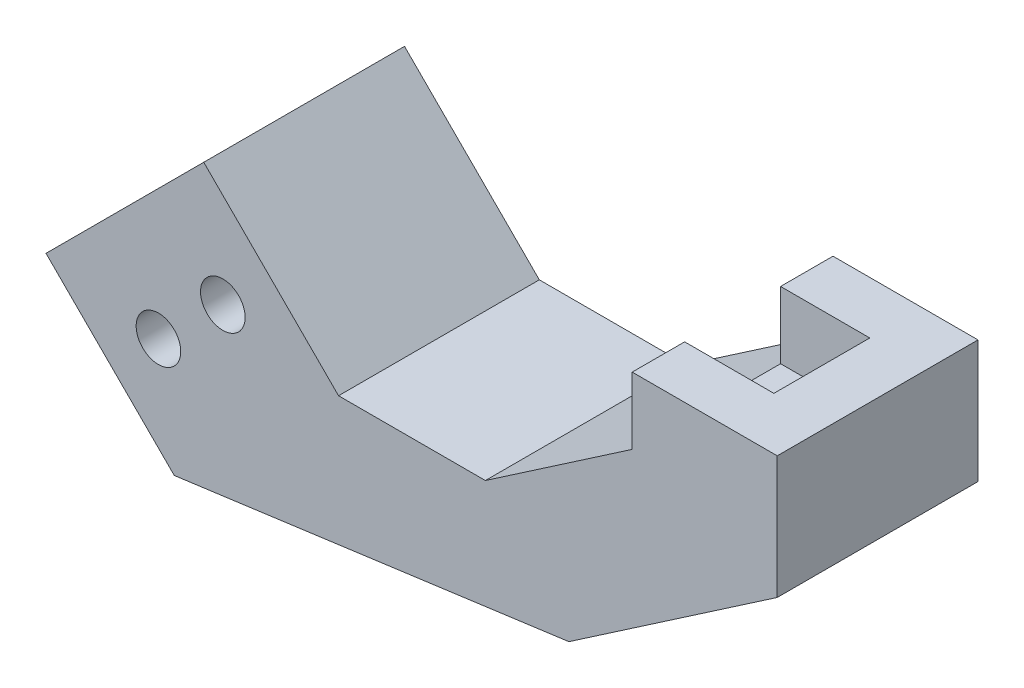
ISO-10303-21;
HEADER;
FILE_DESCRIPTION(('STEP AP214'),'2;1');
FILE_NAME('part.step','',(''),(''),'','','');
FILE_SCHEMA(('AUTOMOTIVE_DESIGN { 1 0 10303 214 1 1 1 1 }'));
ENDSEC;
DATA;
#1=APPLICATION_CONTEXT('core data for automotive mechanical design processes');
#2=APPLICATION_PROTOCOL_DEFINITION('international standard','automotive_design',2000,#1);
#3=PRODUCT_CONTEXT('',#1,'mechanical');
#4=PRODUCT('Part','Part','',(#3));
#5=PRODUCT_RELATED_PRODUCT_CATEGORY('part','',(#4));
#6=PRODUCT_DEFINITION_FORMATION('','',#4);
#7=PRODUCT_DEFINITION_CONTEXT('part definition',#1,'design');
#8=PRODUCT_DEFINITION('design','',#6,#7);
#9=PRODUCT_DEFINITION_SHAPE('','',#8);
#10=(LENGTH_UNIT() NAMED_UNIT(*) SI_UNIT(.MILLI.,.METRE.));
#11=(NAMED_UNIT(*) PLANE_ANGLE_UNIT() SI_UNIT($,.RADIAN.));
#12=(NAMED_UNIT(*) SI_UNIT($,.STERADIAN.) SOLID_ANGLE_UNIT());
#13=UNCERTAINTY_MEASURE_WITH_UNIT(LENGTH_MEASURE(1.E-05),#10,'distance_accuracy_value','');
#14=(GEOMETRIC_REPRESENTATION_CONTEXT(3) GLOBAL_UNCERTAINTY_ASSIGNED_CONTEXT((#13)) GLOBAL_UNIT_ASSIGNED_CONTEXT((#10,
#11,#12)) REPRESENTATION_CONTEXT('',''));
#15=CARTESIAN_POINT('',(0.,0.,0.));
#16=DIRECTION('',(0.,0.,1.));
#17=DIRECTION('',(1.,0.,0.));
#18=AXIS2_PLACEMENT_3D('',#15,#16,#17);
#19=CARTESIAN_POINT('',(0.,0.,5.));
#20=DIRECTION('',(1.,0.,0.));
#21=DIRECTION('',(0.,0.,-1.));
#22=AXIS2_PLACEMENT_3D('',#19,#20,#21);
#23=PLANE('',#22);
#24=DIRECTION('',(0.,-1.,0.));
#25=VECTOR('',#24,1.);
#26=CARTESIAN_POINT('',(0.,15.2784697014109,-8.3));
#27=LINE('',#26,#25);
#28=CARTESIAN_POINT('',(0.,6.,-8.3));
#29=VERTEX_POINT('',#28);
#30=CARTESIAN_POINT('',(0.,0.,-8.3));
#31=VERTEX_POINT('',#30);
#32=EDGE_CURVE('E48',#29,#31,#27,.T.);
#33=ORIENTED_EDGE('',*,*,#32,.T.);
#34=DIRECTION('',(0.,0.,-1.));
#35=VECTOR('',#34,1.);
#36=CARTESIAN_POINT('',(0.,0.,5.));
#37=LINE('',#36,#35);
#38=CARTESIAN_POINT('',(0.,0.,0.3));
#39=VERTEX_POINT('',#38);
#40=EDGE_CURVE('E11',#39,#31,#37,.T.);
#41=ORIENTED_EDGE('',*,*,#40,.F.);
#42=DIRECTION('',(0.,-1.,0.));
#43=VECTOR('',#42,1.);
#44=CARTESIAN_POINT('',(0.,15.2784697014109,0.3));
#45=LINE('',#44,#43);
#46=CARTESIAN_POINT('',(0.,6.,0.3));
#47=VERTEX_POINT('',#46);
#48=EDGE_CURVE('E172',#47,#39,#45,.T.);
#49=ORIENTED_EDGE('',*,*,#48,.F.);
#50=DIRECTION('',(0.,0.,-1.));
#51=VECTOR('',#50,1.);
#52=CARTESIAN_POINT('',(0.,6.,5.));
#53=LINE('',#52,#51);
#54=EDGE_CURVE('E234',#47,#29,#53,.T.);
#55=ORIENTED_EDGE('',*,*,#54,.T.);
#56=EDGE_LOOP('',(#33,#41,#49,#55));
#57=FACE_BOUND('',#56,.T.);
#58=ADVANCED_FACE('F33',(#57),#23,.F.);
#59=CARTESIAN_POINT('',(-8.,0.,5.));
#60=DIRECTION('',(0.,-1.,0.));
#61=DIRECTION('',(0.,0.,-1.));
#62=AXIS2_PLACEMENT_3D('',#59,#60,#61);
#63=PLANE('',#62);
#64=CARTESIAN_POINT('',(-3.,0.,-3.95));
#65=DIRECTION('',(0.,1.,0.));
#66=DIRECTION('',(0.,0.,1.));
#67=AXIS2_PLACEMENT_3D('',#64,#65,#66);
#68=CIRCLE('',#67,1.5);
#69=CARTESIAN_POINT('',(-3.,0.,-2.45));
#70=VERTEX_POINT('',#69);
#71=EDGE_CURVE('E180',#70,#70,#68,.T.);
#72=ORIENTED_EDGE('',*,*,#71,.F.);
#73=EDGE_LOOP('',(#72));
#74=FACE_BOUND('',#73,.T.);
#75=DIRECTION('',(1.,0.,0.));
#76=VECTOR('',#75,1.);
#77=CARTESIAN_POINT('',(-8.,0.,-8.3));
#78=LINE('',#77,#76);
#79=CARTESIAN_POINT('',(-8.,0.,-8.3));
#80=VERTEX_POINT('',#79);
#81=EDGE_CURVE('E54',#80,#31,#78,.T.);
#82=ORIENTED_EDGE('',*,*,#81,.F.);
#83=DIRECTION('',(0.,0.,-1.));
#84=VECTOR('',#83,1.);
#85=CARTESIAN_POINT('',(-8.,0.,5.));
#86=LINE('',#85,#84);
#87=CARTESIAN_POINT('',(-8.,0.,0.3));
#88=VERTEX_POINT('',#87);
#89=EDGE_CURVE('E252',#88,#80,#86,.T.);
#90=ORIENTED_EDGE('',*,*,#89,.F.);
#91=DIRECTION('',(-1.,0.,0.));
#92=VECTOR('',#91,1.);
#93=CARTESIAN_POINT('',(-8.,0.,0.3));
#94=LINE('',#93,#92);
#95=EDGE_CURVE('E146',#39,#88,#94,.T.);
#96=ORIENTED_EDGE('',*,*,#95,.F.);
#97=ORIENTED_EDGE('',*,*,#40,.T.);
#98=EDGE_LOOP('',(#82,#90,#96,#97));
#99=FACE_BOUND('',#98,.T.);
#100=ADVANCED_FACE('F260',(#74,#99),#63,.F.);
#101=CARTESIAN_POINT('',(-8.,0.,5.));
#102=DIRECTION('',(0.56438089256696,-0.82551451114158,0.));
#103=DIRECTION('',(0.82551451114158,0.56438089256696,0.));
#104=AXIS2_PLACEMENT_3D('',#101,#102,#103);
#105=PLANE('',#104);
#106=CARTESIAN_POINT('',(-8.,0.,5.));
#107=VERTEX_POINT('',#106);
#108=EDGE_CURVE('E41',#107,#88,#86,.T.);
#109=ORIENTED_EDGE('',*,*,#108,.T.);
#110=ORIENTED_EDGE('',*,*,#89,.T.);
#111=DIRECTION('',(0.,0.,1.));
#112=VECTOR('',#111,1.);
#113=CARTESIAN_POINT('',(-8.,0.,-13.));
#114=LINE('',#113,#112);
#115=CARTESIAN_POINT('',(-8.,0.,-13.));
#116=VERTEX_POINT('',#115);
#117=EDGE_CURVE('E152',#116,#80,#114,.T.);
#118=ORIENTED_EDGE('',*,*,#117,.F.);
#119=DIRECTION('',(-0.82551451114158,-0.56438089256696,0.));
#120=VECTOR('',#119,1.);
#121=CARTESIAN_POINT('',(-8.,0.,-13.));
#122=LINE('',#121,#120);
#123=CARTESIAN_POINT('',(-21.1642135623731,-8.99999999999999,-13.));
#124=VERTEX_POINT('',#123);
#125=EDGE_CURVE('E191',#116,#124,#122,.T.);
#126=ORIENTED_EDGE('',*,*,#125,.T.);
#127=DIRECTION('',(0.,0.,-1.));
#128=VECTOR('',#127,1.);
#129=CARTESIAN_POINT('',(-21.1642135623731,-8.99999999999999,5.));
#130=LINE('',#129,#128);
#131=CARTESIAN_POINT('',(-21.1642135623731,-8.99999999999999,5.));
#132=VERTEX_POINT('',#131);
#133=EDGE_CURVE('E250',#132,#124,#130,.T.);
#134=ORIENTED_EDGE('',*,*,#133,.F.);
#135=DIRECTION('',(-0.82551451114158,-0.56438089256696,0.));
#136=VECTOR('',#135,1.);
#137=CARTESIAN_POINT('',(-8.,0.,5.));
#138=LINE('',#137,#136);
#139=EDGE_CURVE('E216',#107,#132,#138,.T.);
#140=ORIENTED_EDGE('',*,*,#139,.F.);
#141=EDGE_LOOP('',(#109,#110,#118,#126,#134,#140));
#142=FACE_BOUND('',#141,.T.);
#143=ADVANCED_FACE('F257',(#142),#105,.F.);
#144=CARTESIAN_POINT('',(-34.3284271247462,-8.99999999999999,5.));
#145=DIRECTION('',(0.,-1.,0.));
#146=DIRECTION('',(0.,0.,-1.));
#147=AXIS2_PLACEMENT_3D('',#144,#145,#146);
#148=PLANE('',#147);
#149=ORIENTED_EDGE('',*,*,#133,.T.);
#150=DIRECTION('',(-1.,0.,0.));
#151=VECTOR('',#150,1.);
#152=CARTESIAN_POINT('',(-34.3284271247462,-8.99999999999999,-13.));
#153=LINE('',#152,#151);
#154=CARTESIAN_POINT('',(-34.3284271247462,-8.99999999999999,-13.));
#155=VERTEX_POINT('',#154);
#156=EDGE_CURVE('E194',#124,#155,#153,.T.);
#157=ORIENTED_EDGE('',*,*,#156,.T.);
#158=DIRECTION('',(0.,0.,-1.));
#159=VECTOR('',#158,1.);
#160=CARTESIAN_POINT('',(-34.3284271247462,-8.99999999999999,5.));
#161=LINE('',#160,#159);
#162=CARTESIAN_POINT('',(-34.3284271247462,-8.99999999999999,5.));
#163=VERTEX_POINT('',#162);
#164=EDGE_CURVE('E248',#163,#155,#161,.T.);
#165=ORIENTED_EDGE('',*,*,#164,.F.);
#166=DIRECTION('',(-1.,0.,0.));
#167=VECTOR('',#166,1.);
#168=CARTESIAN_POINT('',(-34.3284271247462,-8.99999999999999,5.));
#169=LINE('',#168,#167);
#170=EDGE_CURVE('E218',#132,#163,#169,.T.);
#171=ORIENTED_EDGE('',*,*,#170,.F.);
#172=EDGE_LOOP('',(#149,#157,#165,#171));
#173=FACE_BOUND('',#172,.T.);
#174=ADVANCED_FACE('F290',(#173),#148,.F.);
#175=CARTESIAN_POINT('',(-46.4142135623731,3.08578643762689,5.));
#176=DIRECTION('',(-0.707106781186547,-0.707106781186548,0.));
#177=DIRECTION('',(0.707106781186548,-0.707106781186547,0.));
#178=AXIS2_PLACEMENT_3D('',#175,#176,#177);
#179=PLANE('',#178);
#180=ORIENTED_EDGE('',*,*,#164,.T.);
#181=DIRECTION('',(-0.707106781186548,0.707106781186547,0.));
#182=VECTOR('',#181,1.);
#183=CARTESIAN_POINT('',(-46.4142135623731,3.08578643762689,-13.));
#184=LINE('',#183,#182);
#185=CARTESIAN_POINT('',(-46.4142135623731,3.08578643762689,-13.));
#186=VERTEX_POINT('',#185);
#187=EDGE_CURVE('E197',#155,#186,#184,.T.);
#188=ORIENTED_EDGE('',*,*,#187,.T.);
#189=DIRECTION('',(0.,0.,-1.));
#190=VECTOR('',#189,1.);
#191=CARTESIAN_POINT('',(-46.4142135623731,3.08578643762689,5.));
#192=LINE('',#191,#190);
#193=CARTESIAN_POINT('',(-46.4142135623731,3.08578643762689,5.));
#194=VERTEX_POINT('',#193);
#195=EDGE_CURVE('E246',#194,#186,#192,.T.);
#196=ORIENTED_EDGE('',*,*,#195,.F.);
#197=DIRECTION('',(-0.707106781186548,0.707106781186547,0.));
#198=VECTOR('',#197,1.);
#199=CARTESIAN_POINT('',(-46.4142135623731,3.08578643762689,5.));
#200=LINE('',#199,#198);
#201=EDGE_CURVE('E220',#163,#194,#200,.T.);
#202=ORIENTED_EDGE('',*,*,#201,.F.);
#203=EDGE_LOOP('',(#180,#188,#196,#202));
#204=FACE_BOUND('',#203,.T.);
#205=ADVANCED_FACE('F296',(#204),#179,.F.);
#206=CARTESIAN_POINT('',(-60.556349186104,-11.056349186104,5.));
#207=DIRECTION('',(0.707106781186547,-0.707106781186548,0.));
#208=DIRECTION('',(0.707106781186548,0.707106781186547,0.));
#209=AXIS2_PLACEMENT_3D('',#206,#207,#208);
#210=PLANE('',#209);
#211=ORIENTED_EDGE('',*,*,#195,.T.);
#212=DIRECTION('',(-0.707106781186548,-0.707106781186547,0.));
#213=VECTOR('',#212,1.);
#214=CARTESIAN_POINT('',(-60.556349186104,-11.056349186104,-13.));
#215=LINE('',#214,#213);
#216=CARTESIAN_POINT('',(-60.556349186104,-11.056349186104,-13.));
#217=VERTEX_POINT('',#216);
#218=EDGE_CURVE('E200',#186,#217,#215,.T.);
#219=ORIENTED_EDGE('',*,*,#218,.T.);
#220=DIRECTION('',(0.,0.,-1.));
#221=VECTOR('',#220,1.);
#222=CARTESIAN_POINT('',(-60.556349186104,-11.056349186104,5.));
#223=LINE('',#222,#221);
#224=CARTESIAN_POINT('',(-60.556349186104,-11.056349186104,5.));
#225=VERTEX_POINT('',#224);
#226=EDGE_CURVE('E244',#225,#217,#223,.T.);
#227=ORIENTED_EDGE('',*,*,#226,.F.);
#228=DIRECTION('',(-0.707106781186548,-0.707106781186547,0.));
#229=VECTOR('',#228,1.);
#230=CARTESIAN_POINT('',(-60.556349186104,-11.056349186104,5.));
#231=LINE('',#230,#229);
#232=EDGE_CURVE('E222',#194,#225,#231,.T.);
#233=ORIENTED_EDGE('',*,*,#232,.F.);
#234=EDGE_LOOP('',(#211,#219,#227,#233));
#235=FACE_BOUND('',#234,.T.);
#236=ADVANCED_FACE('F300',(#235),#210,.F.);
#237=CARTESIAN_POINT('',(-49.0563491861041,-22.556349186104,5.));
#238=DIRECTION('',(0.707106781186548,0.707106781186548,0.));
#239=DIRECTION('',(-0.707106781186548,0.707106781186548,0.));
#240=AXIS2_PLACEMENT_3D('',#237,#238,#239);
#241=PLANE('',#240);
#242=ORIENTED_EDGE('',*,*,#226,.T.);
#243=DIRECTION('',(0.707106781186548,-0.707106781186548,0.));
#244=VECTOR('',#243,1.);
#245=CARTESIAN_POINT('',(-49.0563491861041,-22.556349186104,-13.));
#246=LINE('',#245,#244);
#247=CARTESIAN_POINT('',(-49.0563491861041,-22.556349186104,-13.));
#248=VERTEX_POINT('',#247);
#249=EDGE_CURVE('E203',#217,#248,#246,.T.);
#250=ORIENTED_EDGE('',*,*,#249,.T.);
#251=DIRECTION('',(0.,0.,-1.));
#252=VECTOR('',#251,1.);
#253=CARTESIAN_POINT('',(-49.0563491861041,-22.556349186104,5.));
#254=LINE('',#253,#252);
#255=CARTESIAN_POINT('',(-49.0563491861041,-22.556349186104,5.));
#256=VERTEX_POINT('',#255);
#257=EDGE_CURVE('E242',#256,#248,#254,.T.);
#258=ORIENTED_EDGE('',*,*,#257,.F.);
#259=DIRECTION('',(0.707106781186548,-0.707106781186548,0.));
#260=VECTOR('',#259,1.);
#261=CARTESIAN_POINT('',(-49.0563491861041,-22.556349186104,5.));
#262=LINE('',#261,#260);
#263=EDGE_CURVE('E224',#225,#256,#262,.T.);
#264=ORIENTED_EDGE('',*,*,#263,.F.);
#265=EDGE_LOOP('',(#242,#250,#258,#264));
#266=FACE_BOUND('',#265,.T.);
#267=ADVANCED_FACE('F304',(#266),#241,.F.);
#268=CARTESIAN_POINT('',(-13.6758313657886,-17.7681370023138,5.));
#269=DIRECTION('',(-0.1341121203111,0.990966164500918,0.));
#270=DIRECTION('',(-0.990966164500918,-0.1341121203111,0.));
#271=AXIS2_PLACEMENT_3D('',#268,#269,#270);
#272=PLANE('',#271);
#273=ORIENTED_EDGE('',*,*,#257,.T.);
#274=DIRECTION('',(0.990966164500918,0.1341121203111,0.));
#275=VECTOR('',#274,1.);
#276=CARTESIAN_POINT('',(-13.6758313657886,-17.7681370023138,-13.));
#277=LINE('',#276,#275);
#278=CARTESIAN_POINT('',(-13.6758313657886,-17.7681370023138,-13.));
#279=VERTEX_POINT('',#278);
#280=EDGE_CURVE('E206',#248,#279,#277,.T.);
#281=ORIENTED_EDGE('',*,*,#280,.T.);
#282=DIRECTION('',(0.,0.,-1.));
#283=VECTOR('',#282,1.);
#284=CARTESIAN_POINT('',(-13.6758313657886,-17.7681370023138,5.));
#285=LINE('',#284,#283);
#286=CARTESIAN_POINT('',(-13.6758313657886,-17.7681370023138,5.));
#287=VERTEX_POINT('',#286);
#288=EDGE_CURVE('E240',#287,#279,#285,.T.);
#289=ORIENTED_EDGE('',*,*,#288,.F.);
#290=DIRECTION('',(0.990966164500918,0.1341121203111,0.));
#291=VECTOR('',#290,1.);
#292=CARTESIAN_POINT('',(-13.6758313657886,-17.7681370023138,5.));
#293=LINE('',#292,#291);
#294=EDGE_CURVE('E226',#256,#287,#293,.T.);
#295=ORIENTED_EDGE('',*,*,#294,.F.);
#296=EDGE_LOOP('',(#273,#281,#289,#295));
#297=FACE_BOUND('',#296,.T.);
#298=ADVANCED_FACE('F308',(#297),#272,.F.);
#299=CARTESIAN_POINT('',(5.,-5.,5.));
#300=DIRECTION('',(-0.56438089256696,0.82551451114158,0.));
#301=DIRECTION('',(-0.82551451114158,-0.56438089256696,0.));
#302=AXIS2_PLACEMENT_3D('',#299,#300,#301);
#303=PLANE('',#302);
#304=CARTESIAN_POINT('',(-3.,-10.4693734387442,-3.95));
#305=DIRECTION('',(-0.56438089256696,0.82551451114158,0.));
#306=DIRECTION('',(0.82551451114158,0.56438089256696,0.));
#307=AXIS2_PLACEMENT_3D('',#304,#305,#306);
#308=ELLIPSE('',#307,1.81704861605121,1.5);
#309=CARTESIAN_POINT('',(-1.5,-9.44386591897968,-3.95));
#310=VERTEX_POINT('',#309);
#311=EDGE_CURVE('E36',#310,#310,#308,.T.);
#312=ORIENTED_EDGE('',*,*,#311,.T.);
#313=EDGE_LOOP('',(#312));
#314=FACE_BOUND('',#313,.T.);
#315=ORIENTED_EDGE('',*,*,#288,.T.);
#316=DIRECTION('',(0.82551451114158,0.56438089256696,0.));
#317=VECTOR('',#316,1.);
#318=CARTESIAN_POINT('',(5.,-5.,-13.));
#319=LINE('',#318,#317);
#320=CARTESIAN_POINT('',(5.,-5.,-13.));
#321=VERTEX_POINT('',#320);
#322=EDGE_CURVE('E209',#279,#321,#319,.T.);
#323=ORIENTED_EDGE('',*,*,#322,.T.);
#324=DIRECTION('',(0.,0.,-1.));
#325=VECTOR('',#324,1.);
#326=CARTESIAN_POINT('',(5.,-5.,5.));
#327=LINE('',#326,#325);
#328=CARTESIAN_POINT('',(5.,-5.,5.));
#329=VERTEX_POINT('',#328);
#330=EDGE_CURVE('E238',#329,#321,#327,.T.);
#331=ORIENTED_EDGE('',*,*,#330,.F.);
#332=DIRECTION('',(0.82551451114158,0.56438089256696,0.));
#333=VECTOR('',#332,1.);
#334=CARTESIAN_POINT('',(5.,-5.,5.));
#335=LINE('',#334,#333);
#336=EDGE_CURVE('E228',#287,#329,#335,.T.);
#337=ORIENTED_EDGE('',*,*,#336,.F.);
#338=EDGE_LOOP('',(#315,#323,#331,#337));
#339=FACE_BOUND('',#338,.T.);
#340=ADVANCED_FACE('F312',(#314,#339),#303,.F.);
#341=CARTESIAN_POINT('',(5.,6.,5.));
#342=DIRECTION('',(-1.,0.,0.));
#343=DIRECTION('',(0.,-1.,0.));
#344=AXIS2_PLACEMENT_3D('',#341,#342,#343);
#345=PLANE('',#344);
#346=ORIENTED_EDGE('',*,*,#330,.T.);
#347=DIRECTION('',(0.,1.,0.));
#348=VECTOR('',#347,1.);
#349=CARTESIAN_POINT('',(5.,6.,-13.));
#350=LINE('',#349,#348);
#351=CARTESIAN_POINT('',(5.,6.,-13.));
#352=VERTEX_POINT('',#351);
#353=EDGE_CURVE('E212',#321,#352,#350,.T.);
#354=ORIENTED_EDGE('',*,*,#353,.T.);
#355=DIRECTION('',(0.,0.,-1.));
#356=VECTOR('',#355,1.);
#357=CARTESIAN_POINT('',(5.,6.,5.));
#358=LINE('',#357,#356);
#359=CARTESIAN_POINT('',(5.,6.,5.));
#360=VERTEX_POINT('',#359);
#361=EDGE_CURVE('E236',#360,#352,#358,.T.);
#362=ORIENTED_EDGE('',*,*,#361,.F.);
#363=DIRECTION('',(0.,1.,0.));
#364=VECTOR('',#363,1.);
#365=CARTESIAN_POINT('',(5.,6.,5.));
#366=LINE('',#365,#364);
#367=EDGE_CURVE('E230',#329,#360,#366,.T.);
#368=ORIENTED_EDGE('',*,*,#367,.F.);
#369=EDGE_LOOP('',(#346,#354,#362,#368));
#370=FACE_BOUND('',#369,.T.);
#371=ADVANCED_FACE('F316',(#370),#345,.F.);
#372=CARTESIAN_POINT('',(0.,6.,5.));
#373=DIRECTION('',(0.,-1.,0.));
#374=DIRECTION('',(0.,0.,-1.));
#375=AXIS2_PLACEMENT_3D('',#372,#373,#374);
#376=PLANE('',#375);
#377=ORIENTED_EDGE('',*,*,#361,.T.);
#378=DIRECTION('',(-1.,0.,0.));
#379=VECTOR('',#378,1.);
#380=CARTESIAN_POINT('',(0.,6.,-13.));
#381=LINE('',#380,#379);
#382=CARTESIAN_POINT('',(-8.,6.,-13.));
#383=VERTEX_POINT('',#382);
#384=EDGE_CURVE('E142',#352,#383,#381,.T.);
#385=ORIENTED_EDGE('',*,*,#384,.T.);
#386=DIRECTION('',(0.,0.,-1.));
#387=VECTOR('',#386,1.);
#388=CARTESIAN_POINT('',(-8.,6.,-13.));
#389=LINE('',#388,#387);
#390=CARTESIAN_POINT('',(-8.,6.,-8.3));
#391=VERTEX_POINT('',#390);
#392=EDGE_CURVE('E135',#391,#383,#389,.T.);
#393=ORIENTED_EDGE('',*,*,#392,.F.);
#394=DIRECTION('',(-1.,0.,0.));
#395=VECTOR('',#394,1.);
#396=CARTESIAN_POINT('',(-8.,6.,-8.3));
#397=LINE('',#396,#395);
#398=EDGE_CURVE('E140',#29,#391,#397,.T.);
#399=ORIENTED_EDGE('',*,*,#398,.F.);
#400=ORIENTED_EDGE('',*,*,#54,.F.);
#401=DIRECTION('',(1.,0.,0.));
#402=VECTOR('',#401,1.);
#403=CARTESIAN_POINT('',(-8.,6.,0.3));
#404=LINE('',#403,#402);
#405=CARTESIAN_POINT('',(-8.,6.,0.3));
#406=VERTEX_POINT('',#405);
#407=EDGE_CURVE('E167',#406,#47,#404,.T.);
#408=ORIENTED_EDGE('',*,*,#407,.F.);
#409=DIRECTION('',(0.,0.,-1.));
#410=VECTOR('',#409,1.);
#411=CARTESIAN_POINT('',(-8.,6.,5.));
#412=LINE('',#411,#410);
#413=CARTESIAN_POINT('',(-8.,6.,5.));
#414=VERTEX_POINT('',#413);
#415=EDGE_CURVE('E163',#414,#406,#412,.T.);
#416=ORIENTED_EDGE('',*,*,#415,.F.);
#417=DIRECTION('',(-1.,0.,0.));
#418=VECTOR('',#417,1.);
#419=CARTESIAN_POINT('',(0.,6.,5.));
#420=LINE('',#419,#418);
#421=EDGE_CURVE('E232',#360,#414,#420,.T.);
#422=ORIENTED_EDGE('',*,*,#421,.F.);
#423=EDGE_LOOP('',(#377,#385,#393,#399,#400,#408,#416,#422));
#424=FACE_BOUND('',#423,.T.);
#425=ADVANCED_FACE('F137',(#424),#376,.F.);
#426=CARTESIAN_POINT('',(0.,0.,5.));
#427=DIRECTION('',(0.,0.,-1.));
#428=DIRECTION('',(-1.,0.,0.));
#429=AXIS2_PLACEMENT_3D('',#426,#427,#428);
#430=PLANE('',#429);
#431=DIRECTION('',(0.,-1.,0.));
#432=VECTOR('',#431,1.);
#433=CARTESIAN_POINT('',(-8.,15.2784697014109,5.));
#434=LINE('',#433,#432);
#435=EDGE_CURVE('E174',#414,#107,#434,.T.);
#436=ORIENTED_EDGE('',*,*,#435,.T.);
#437=ORIENTED_EDGE('',*,*,#139,.T.);
#438=ORIENTED_EDGE('',*,*,#170,.T.);
#439=ORIENTED_EDGE('',*,*,#201,.T.);
#440=ORIENTED_EDGE('',*,*,#232,.T.);
#441=ORIENTED_EDGE('',*,*,#263,.T.);
#442=ORIENTED_EDGE('',*,*,#294,.T.);
#443=ORIENTED_EDGE('',*,*,#336,.T.);
#444=ORIENTED_EDGE('',*,*,#367,.T.);
#445=ORIENTED_EDGE('',*,*,#421,.T.);
#446=EDGE_LOOP('',(#436,#437,#438,#439,#440,#441,#442,#443,#444,#445));
#447=FACE_BOUND('',#446,.T.);
#448=CARTESIAN_POINT('',(-50.4757373723845,-12.6514774900369,5.));
#449=DIRECTION('',(0.,0.,-1.));
#450=DIRECTION('',(-1.,0.,0.));
#451=AXIS2_PLACEMENT_3D('',#448,#449,#450);
#452=CIRCLE('',#451,2.);
#453=CARTESIAN_POINT('',(-52.4757373723846,-12.6514774900369,5.));
#454=VERTEX_POINT('',#453);
#455=EDGE_CURVE('E177',#454,#454,#452,.T.);
#456=ORIENTED_EDGE('',*,*,#455,.T.);
#457=EDGE_LOOP('',(#456));
#458=FACE_BOUND('',#457,.T.);
#459=CARTESIAN_POINT('',(-44.7019321572791,-7.11197847725371,5.));
#460=DIRECTION('',(0.,0.,-1.));
#461=DIRECTION('',(-1.,0.,0.));
#462=AXIS2_PLACEMENT_3D('',#459,#460,#461);
#463=CIRCLE('',#462,2.);
#464=CARTESIAN_POINT('',(-46.7019321572791,-7.11197847725371,5.));
#465=VERTEX_POINT('',#464);
#466=EDGE_CURVE('E184',#465,#465,#463,.T.);
#467=ORIENTED_EDGE('',*,*,#466,.T.);
#468=EDGE_LOOP('',(#467));
#469=FACE_BOUND('',#468,.T.);
#470=ADVANCED_FACE('F323',(#447,#458,#469),#430,.F.);
#471=CARTESIAN_POINT('',(0.,0.,-13.));
#472=DIRECTION('',(0.,0.,-1.));
#473=DIRECTION('',(-1.,0.,0.));
#474=AXIS2_PLACEMENT_3D('',#471,#472,#473);
#475=PLANE('',#474);
#476=ORIENTED_EDGE('',*,*,#125,.F.);
#477=DIRECTION('',(0.,-1.,0.));
#478=VECTOR('',#477,1.);
#479=CARTESIAN_POINT('',(-8.,15.2784697014109,-13.));
#480=LINE('',#479,#478);
#481=EDGE_CURVE('E160',#383,#116,#480,.T.);
#482=ORIENTED_EDGE('',*,*,#481,.F.);
#483=ORIENTED_EDGE('',*,*,#384,.F.);
#484=ORIENTED_EDGE('',*,*,#353,.F.);
#485=ORIENTED_EDGE('',*,*,#322,.F.);
#486=ORIENTED_EDGE('',*,*,#280,.F.);
#487=ORIENTED_EDGE('',*,*,#249,.F.);
#488=ORIENTED_EDGE('',*,*,#218,.F.);
#489=ORIENTED_EDGE('',*,*,#187,.F.);
#490=ORIENTED_EDGE('',*,*,#156,.F.);
#491=EDGE_LOOP('',(#476,#482,#483,#484,#485,#486,#487,#488,#489,#490));
#492=FACE_BOUND('',#491,.T.);
#493=CARTESIAN_POINT('',(-50.4757373723845,-12.6514774900369,-13.));
#494=DIRECTION('',(0.,0.,-1.));
#495=DIRECTION('',(-1.,0.,0.));
#496=AXIS2_PLACEMENT_3D('',#493,#494,#495);
#497=CIRCLE('',#496,2.);
#498=CARTESIAN_POINT('',(-52.4757373723846,-12.6514774900369,-13.));
#499=VERTEX_POINT('',#498);
#500=EDGE_CURVE('E181',#499,#499,#497,.T.);
#501=ORIENTED_EDGE('',*,*,#500,.F.);
#502=EDGE_LOOP('',(#501));
#503=FACE_BOUND('',#502,.T.);
#504=CARTESIAN_POINT('',(-44.7019321572791,-7.11197847725371,-13.));
#505=DIRECTION('',(0.,0.,-1.));
#506=DIRECTION('',(-1.,0.,0.));
#507=AXIS2_PLACEMENT_3D('',#504,#505,#506);
#508=CIRCLE('',#507,2.);
#509=CARTESIAN_POINT('',(-46.7019321572791,-7.11197847725371,-13.));
#510=VERTEX_POINT('',#509);
#511=EDGE_CURVE('E166',#510,#510,#508,.T.);
#512=ORIENTED_EDGE('',*,*,#511,.F.);
#513=EDGE_LOOP('',(#512));
#514=FACE_BOUND('',#513,.T.);
#515=ADVANCED_FACE('F326',(#492,#503,#514),#475,.T.);
#516=CARTESIAN_POINT('',(-3.,-22.556349186104,-3.95));
#517=DIRECTION('',(0.,1.,0.));
#518=DIRECTION('',(0.,0.,1.));
#519=AXIS2_PLACEMENT_3D('',#516,#517,#518);
#520=CYLINDRICAL_SURFACE('',#519,1.5);
#521=ORIENTED_EDGE('',*,*,#71,.T.);
#522=EDGE_LOOP('',(#521));
#523=FACE_BOUND('',#522,.T.);
#524=ORIENTED_EDGE('',*,*,#311,.F.);
#525=EDGE_LOOP('',(#524));
#526=FACE_BOUND('',#525,.T.);
#527=ADVANCED_FACE('F330',(#523,#526),#520,.F.);
#528=CARTESIAN_POINT('',(-44.7019321572791,-7.11197847725371,5.));
#529=DIRECTION('',(0.,0.,-1.));
#530=DIRECTION('',(-1.,0.,0.));
#531=AXIS2_PLACEMENT_3D('',#528,#529,#530);
#532=CYLINDRICAL_SURFACE('',#531,2.);
#533=ORIENTED_EDGE('',*,*,#466,.F.);
#534=EDGE_LOOP('',(#533));
#535=FACE_BOUND('',#534,.T.);
#536=ORIENTED_EDGE('',*,*,#511,.T.);
#537=EDGE_LOOP('',(#536));
#538=FACE_BOUND('',#537,.T.);
#539=ADVANCED_FACE('F278',(#535,#538),#532,.F.);
#540=CARTESIAN_POINT('',(-50.4757373723845,-12.6514774900369,5.));
#541=DIRECTION('',(0.,0.,-1.));
#542=DIRECTION('',(-1.,0.,0.));
#543=AXIS2_PLACEMENT_3D('',#540,#541,#542);
#544=CYLINDRICAL_SURFACE('',#543,2.);
#545=ORIENTED_EDGE('',*,*,#455,.F.);
#546=EDGE_LOOP('',(#545));
#547=FACE_BOUND('',#546,.T.);
#548=ORIENTED_EDGE('',*,*,#500,.T.);
#549=EDGE_LOOP('',(#548));
#550=FACE_BOUND('',#549,.T.);
#551=ADVANCED_FACE('F271',(#547,#550),#544,.F.);
#552=CARTESIAN_POINT('',(-8.,15.2784697014109,0.3));
#553=DIRECTION('',(0.,0.,1.));
#554=DIRECTION('',(1.,0.,0.));
#555=AXIS2_PLACEMENT_3D('',#552,#553,#554);
#556=PLANE('',#555);
#557=DIRECTION('',(0.,-1.,0.));
#558=VECTOR('',#557,1.);
#559=CARTESIAN_POINT('',(-8.,15.2784697014109,0.3));
#560=LINE('',#559,#558);
#561=EDGE_CURVE('E170',#406,#88,#560,.T.);
#562=ORIENTED_EDGE('',*,*,#561,.F.);
#563=ORIENTED_EDGE('',*,*,#407,.T.);
#564=ORIENTED_EDGE('',*,*,#48,.T.);
#565=ORIENTED_EDGE('',*,*,#95,.T.);
#566=EDGE_LOOP('',(#562,#563,#564,#565));
#567=FACE_BOUND('',#566,.T.);
#568=ADVANCED_FACE('F269',(#567),#556,.F.);
#569=CARTESIAN_POINT('',(-8.,15.2784697014109,5.));
#570=DIRECTION('',(1.,0.,0.));
#571=DIRECTION('',(0.,0.,-1.));
#572=AXIS2_PLACEMENT_3D('',#569,#570,#571);
#573=PLANE('',#572);
#574=ORIENTED_EDGE('',*,*,#435,.F.);
#575=ORIENTED_EDGE('',*,*,#415,.T.);
#576=ORIENTED_EDGE('',*,*,#561,.T.);
#577=ORIENTED_EDGE('',*,*,#108,.F.);
#578=EDGE_LOOP('',(#574,#575,#576,#577));
#579=FACE_BOUND('',#578,.T.);
#580=ADVANCED_FACE('F268',(#579),#573,.F.);
#581=CARTESIAN_POINT('',(-8.,15.2784697014109,-8.3));
#582=DIRECTION('',(0.,0.,-1.));
#583=DIRECTION('',(-1.,0.,0.));
#584=AXIS2_PLACEMENT_3D('',#581,#582,#583);
#585=PLANE('',#584);
#586=ORIENTED_EDGE('',*,*,#32,.F.);
#587=ORIENTED_EDGE('',*,*,#398,.T.);
#588=DIRECTION('',(0.,-1.,0.));
#589=VECTOR('',#588,1.);
#590=CARTESIAN_POINT('',(-8.,15.2784697014109,-8.3));
#591=LINE('',#590,#589);
#592=EDGE_CURVE('E150',#391,#80,#591,.T.);
#593=ORIENTED_EDGE('',*,*,#592,.T.);
#594=ORIENTED_EDGE('',*,*,#81,.T.);
#595=EDGE_LOOP('',(#586,#587,#593,#594));
#596=FACE_BOUND('',#595,.T.);
#597=ADVANCED_FACE('F155',(#596),#585,.F.);
#598=CARTESIAN_POINT('',(-8.,15.2784697014109,-13.));
#599=DIRECTION('',(1.,0.,0.));
#600=DIRECTION('',(0.,0.,-1.));
#601=AXIS2_PLACEMENT_3D('',#598,#599,#600);
#602=PLANE('',#601);
#603=ORIENTED_EDGE('',*,*,#592,.F.);
#604=ORIENTED_EDGE('',*,*,#392,.T.);
#605=ORIENTED_EDGE('',*,*,#481,.T.);
#606=ORIENTED_EDGE('',*,*,#117,.T.);
#607=EDGE_LOOP('',(#603,#604,#605,#606));
#608=FACE_BOUND('',#607,.T.);
#609=ADVANCED_FACE('F151',(#608),#602,.F.);
#610=CLOSED_SHELL('',(#58,#100,#143,#174,#205,#236,#267,#298,#340,#371,#425,#470,#515,#527,#539,
#551,#568,#580,#597,#609));
#611=MANIFOLD_SOLID_BREP('B2',#610);
#612=ADVANCED_BREP_SHAPE_REPRESENTATION('',(#18,#611),#14);
#613=SHAPE_DEFINITION_REPRESENTATION(#9,#612);
ENDSEC;
END-ISO-10303-21;
